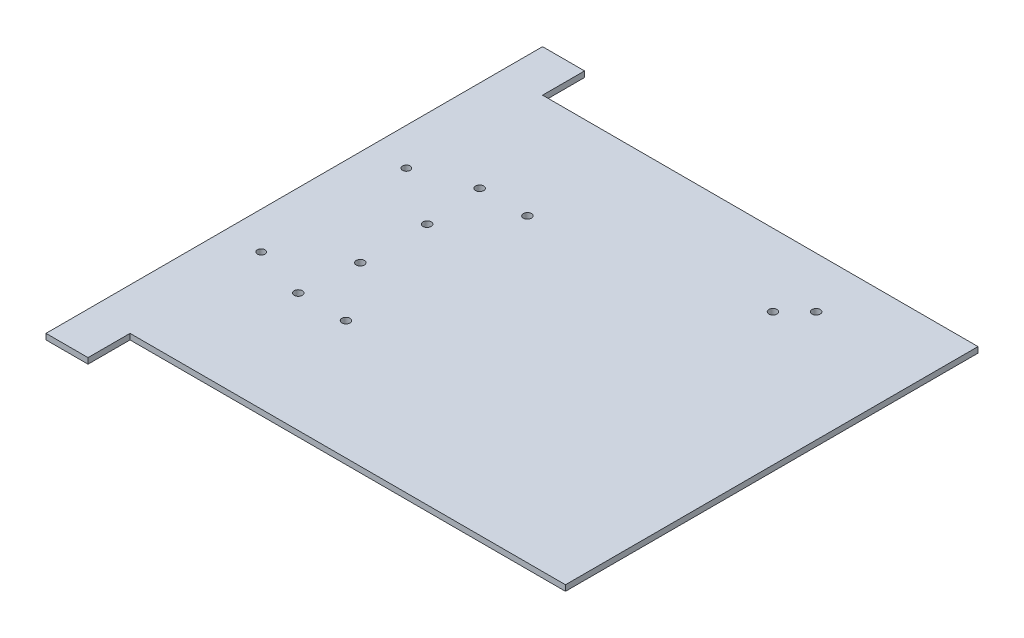
ISO-10303-21;
HEADER;
FILE_DESCRIPTION(('STEP AP214'),'2;1');
FILE_NAME('part.step','',(''),(''),'','','');
FILE_SCHEMA(('AUTOMOTIVE_DESIGN { 1 0 10303 214 1 1 1 1 }'));
ENDSEC;
DATA;
#1=APPLICATION_CONTEXT('core data for automotive mechanical design processes');
#2=APPLICATION_PROTOCOL_DEFINITION('international standard','automotive_design',2000,#1);
#3=PRODUCT_CONTEXT('',#1,'mechanical');
#4=PRODUCT('Part','Part','',(#3));
#5=PRODUCT_RELATED_PRODUCT_CATEGORY('part','',(#4));
#6=PRODUCT_DEFINITION_FORMATION('','',#4);
#7=PRODUCT_DEFINITION_CONTEXT('part definition',#1,'design');
#8=PRODUCT_DEFINITION('design','',#6,#7);
#9=PRODUCT_DEFINITION_SHAPE('','',#8);
#10=(LENGTH_UNIT() NAMED_UNIT(*) SI_UNIT(.MILLI.,.METRE.));
#11=(NAMED_UNIT(*) PLANE_ANGLE_UNIT() SI_UNIT($,.RADIAN.));
#12=(NAMED_UNIT(*) SI_UNIT($,.STERADIAN.) SOLID_ANGLE_UNIT());
#13=UNCERTAINTY_MEASURE_WITH_UNIT(LENGTH_MEASURE(1.E-05),#10,'distance_accuracy_value','');
#14=(GEOMETRIC_REPRESENTATION_CONTEXT(3) GLOBAL_UNCERTAINTY_ASSIGNED_CONTEXT((#13)) GLOBAL_UNIT_ASSIGNED_CONTEXT((#10,
#11,#12)) REPRESENTATION_CONTEXT('',''));
#15=CARTESIAN_POINT('',(0.,0.,0.));
#16=DIRECTION('',(0.,0.,1.));
#17=DIRECTION('',(1.,0.,0.));
#18=AXIS2_PLACEMENT_3D('',#15,#16,#17);
#19=CARTESIAN_POINT('',(-338.,3.,-108.));
#20=DIRECTION('',(0.,0.,1.));
#21=DIRECTION('',(1.,0.,0.));
#22=AXIS2_PLACEMENT_3D('',#19,#20,#21);
#23=PLANE('',#22);
#24=DIRECTION('',(-1.,0.,0.));
#25=VECTOR('',#24,1.);
#26=CARTESIAN_POINT('',(-338.,3.,-108.));
#27=LINE('',#26,#25);
#28=CARTESIAN_POINT('',(-110.,3.,-108.));
#29=VERTEX_POINT('',#28);
#30=CARTESIAN_POINT('',(-338.,3.,-108.));
#31=VERTEX_POINT('',#30);
#32=EDGE_CURVE('E97',#29,#31,#27,.T.);
#33=ORIENTED_EDGE('',*,*,#32,.F.);
#34=DIRECTION('',(0.,-1.,0.));
#35=VECTOR('',#34,1.);
#36=CARTESIAN_POINT('',(-110.,3.,-108.));
#37=LINE('',#36,#35);
#38=CARTESIAN_POINT('',(-110.,0.,-108.));
#39=VERTEX_POINT('',#38);
#40=EDGE_CURVE('E176',#29,#39,#37,.T.);
#41=ORIENTED_EDGE('',*,*,#40,.T.);
#42=DIRECTION('',(-1.,0.,0.));
#43=VECTOR('',#42,1.);
#44=CARTESIAN_POINT('',(-338.,0.,-108.));
#45=LINE('',#44,#43);
#46=CARTESIAN_POINT('',(-338.,0.,-108.));
#47=VERTEX_POINT('',#46);
#48=EDGE_CURVE('E138',#39,#47,#45,.T.);
#49=ORIENTED_EDGE('',*,*,#48,.T.);
#50=DIRECTION('',(0.,-1.,0.));
#51=VECTOR('',#50,1.);
#52=CARTESIAN_POINT('',(-338.,3.,-108.));
#53=LINE('',#52,#51);
#54=EDGE_CURVE('E11',#31,#47,#53,.T.);
#55=ORIENTED_EDGE('',*,*,#54,.F.);
#56=EDGE_LOOP('',(#33,#41,#49,#55));
#57=FACE_BOUND('',#56,.T.);
#58=ADVANCED_FACE('F39',(#57),#23,.F.);
#59=CARTESIAN_POINT('',(-338.,3.,-130.));
#60=DIRECTION('',(-1.,0.,0.));
#61=DIRECTION('',(0.,0.,1.));
#62=AXIS2_PLACEMENT_3D('',#59,#60,#61);
#63=PLANE('',#62);
#64=DIRECTION('',(0.,0.,-1.));
#65=VECTOR('',#64,1.);
#66=CARTESIAN_POINT('',(-338.,0.,-130.));
#67=LINE('',#66,#65);
#68=CARTESIAN_POINT('',(-338.,0.,-130.));
#69=VERTEX_POINT('',#68);
#70=EDGE_CURVE('E140',#47,#69,#67,.T.);
#71=ORIENTED_EDGE('',*,*,#70,.T.);
#72=DIRECTION('',(0.,-1.,0.));
#73=VECTOR('',#72,1.);
#74=CARTESIAN_POINT('',(-338.,3.,-130.));
#75=LINE('',#74,#73);
#76=CARTESIAN_POINT('',(-338.,3.,-130.));
#77=VERTEX_POINT('',#76);
#78=EDGE_CURVE('E46',#77,#69,#75,.T.);
#79=ORIENTED_EDGE('',*,*,#78,.F.);
#80=DIRECTION('',(0.,0.,-1.));
#81=VECTOR('',#80,1.);
#82=CARTESIAN_POINT('',(-338.,3.,-130.));
#83=LINE('',#82,#81);
#84=EDGE_CURVE('E244',#31,#77,#83,.T.);
#85=ORIENTED_EDGE('',*,*,#84,.F.);
#86=ORIENTED_EDGE('',*,*,#54,.T.);
#87=EDGE_LOOP('',(#71,#79,#85,#86));
#88=FACE_BOUND('',#87,.T.);
#89=ADVANCED_FACE('F245',(#88),#63,.F.);
#90=CARTESIAN_POINT('',(-360.,3.,-130.));
#91=DIRECTION('',(0.,0.,1.));
#92=DIRECTION('',(1.,0.,0.));
#93=AXIS2_PLACEMENT_3D('',#90,#91,#92);
#94=PLANE('',#93);
#95=DIRECTION('',(-1.,0.,0.));
#96=VECTOR('',#95,1.);
#97=CARTESIAN_POINT('',(-360.,0.,-130.));
#98=LINE('',#97,#96);
#99=CARTESIAN_POINT('',(-360.,0.,-130.));
#100=VERTEX_POINT('',#99);
#101=EDGE_CURVE('E143',#69,#100,#98,.T.);
#102=ORIENTED_EDGE('',*,*,#101,.T.);
#103=DIRECTION('',(0.,-1.,0.));
#104=VECTOR('',#103,1.);
#105=CARTESIAN_POINT('',(-360.,3.,-130.));
#106=LINE('',#105,#104);
#107=CARTESIAN_POINT('',(-360.,3.,-130.));
#108=VERTEX_POINT('',#107);
#109=EDGE_CURVE('E127',#108,#100,#106,.T.);
#110=ORIENTED_EDGE('',*,*,#109,.F.);
#111=DIRECTION('',(-1.,0.,0.));
#112=VECTOR('',#111,1.);
#113=CARTESIAN_POINT('',(-360.,3.,-130.));
#114=LINE('',#113,#112);
#115=EDGE_CURVE('E115',#77,#108,#114,.T.);
#116=ORIENTED_EDGE('',*,*,#115,.F.);
#117=ORIENTED_EDGE('',*,*,#78,.T.);
#118=EDGE_LOOP('',(#102,#110,#116,#117));
#119=FACE_BOUND('',#118,.T.);
#120=ADVANCED_FACE('F158',(#119),#94,.F.);
#121=CARTESIAN_POINT('',(-360.,3.,130.));
#122=DIRECTION('',(1.,0.,0.));
#123=DIRECTION('',(0.,0.,-1.));
#124=AXIS2_PLACEMENT_3D('',#121,#122,#123);
#125=PLANE('',#124);
#126=DIRECTION('',(0.,0.,1.));
#127=VECTOR('',#126,1.);
#128=CARTESIAN_POINT('',(-360.,0.,130.));
#129=LINE('',#128,#127);
#130=CARTESIAN_POINT('',(-360.,0.,130.));
#131=VERTEX_POINT('',#130);
#132=EDGE_CURVE('E124',#100,#131,#129,.T.);
#133=ORIENTED_EDGE('',*,*,#132,.T.);
#134=DIRECTION('',(0.,-1.,0.));
#135=VECTOR('',#134,1.);
#136=CARTESIAN_POINT('',(-360.,3.,130.));
#137=LINE('',#136,#135);
#138=CARTESIAN_POINT('',(-360.,3.,130.));
#139=VERTEX_POINT('',#138);
#140=EDGE_CURVE('E121',#139,#131,#137,.T.);
#141=ORIENTED_EDGE('',*,*,#140,.F.);
#142=DIRECTION('',(0.,0.,1.));
#143=VECTOR('',#142,1.);
#144=CARTESIAN_POINT('',(-360.,3.,130.));
#145=LINE('',#144,#143);
#146=EDGE_CURVE('E107',#108,#139,#145,.T.);
#147=ORIENTED_EDGE('',*,*,#146,.F.);
#148=ORIENTED_EDGE('',*,*,#109,.T.);
#149=EDGE_LOOP('',(#133,#141,#147,#148));
#150=FACE_BOUND('',#149,.T.);
#151=ADVANCED_FACE('F122',(#150),#125,.F.);
#152=CARTESIAN_POINT('',(-360.,3.,130.));
#153=DIRECTION('',(0.,0.,-1.));
#154=DIRECTION('',(-1.,0.,0.));
#155=AXIS2_PLACEMENT_3D('',#152,#153,#154);
#156=PLANE('',#155);
#157=DIRECTION('',(1.,0.,0.));
#158=VECTOR('',#157,1.);
#159=CARTESIAN_POINT('',(-360.,0.,130.));
#160=LINE('',#159,#158);
#161=CARTESIAN_POINT('',(-338.,0.,130.));
#162=VERTEX_POINT('',#161);
#163=EDGE_CURVE('E146',#131,#162,#160,.T.);
#164=ORIENTED_EDGE('',*,*,#163,.T.);
#165=DIRECTION('',(0.,-1.,0.));
#166=VECTOR('',#165,1.);
#167=CARTESIAN_POINT('',(-338.,3.,130.));
#168=LINE('',#167,#166);
#169=CARTESIAN_POINT('',(-338.,3.,130.));
#170=VERTEX_POINT('',#169);
#171=EDGE_CURVE('E128',#170,#162,#168,.T.);
#172=ORIENTED_EDGE('',*,*,#171,.F.);
#173=DIRECTION('',(1.,0.,0.));
#174=VECTOR('',#173,1.);
#175=CARTESIAN_POINT('',(-360.,3.,130.));
#176=LINE('',#175,#174);
#177=EDGE_CURVE('E112',#139,#170,#176,.T.);
#178=ORIENTED_EDGE('',*,*,#177,.F.);
#179=ORIENTED_EDGE('',*,*,#140,.T.);
#180=EDGE_LOOP('',(#164,#172,#178,#179));
#181=FACE_BOUND('',#180,.T.);
#182=ADVANCED_FACE('F130',(#181),#156,.F.);
#183=CARTESIAN_POINT('',(-338.,3.,130.));
#184=DIRECTION('',(-1.,0.,0.));
#185=DIRECTION('',(0.,0.,1.));
#186=AXIS2_PLACEMENT_3D('',#183,#184,#185);
#187=PLANE('',#186);
#188=DIRECTION('',(0.,0.,-1.));
#189=VECTOR('',#188,1.);
#190=CARTESIAN_POINT('',(-338.,0.,130.));
#191=LINE('',#190,#189);
#192=CARTESIAN_POINT('',(-338.,0.,108.));
#193=VERTEX_POINT('',#192);
#194=EDGE_CURVE('E89',#162,#193,#191,.T.);
#195=ORIENTED_EDGE('',*,*,#194,.T.);
#196=DIRECTION('',(0.,-1.,0.));
#197=VECTOR('',#196,1.);
#198=CARTESIAN_POINT('',(-338.,3.,108.));
#199=LINE('',#198,#197);
#200=CARTESIAN_POINT('',(-338.,3.,108.));
#201=VERTEX_POINT('',#200);
#202=EDGE_CURVE('E137',#201,#193,#199,.T.);
#203=ORIENTED_EDGE('',*,*,#202,.F.);
#204=DIRECTION('',(0.,0.,-1.));
#205=VECTOR('',#204,1.);
#206=CARTESIAN_POINT('',(-338.,3.,130.));
#207=LINE('',#206,#205);
#208=EDGE_CURVE('E62',#170,#201,#207,.T.);
#209=ORIENTED_EDGE('',*,*,#208,.F.);
#210=ORIENTED_EDGE('',*,*,#171,.T.);
#211=EDGE_LOOP('',(#195,#203,#209,#210));
#212=FACE_BOUND('',#211,.T.);
#213=ADVANCED_FACE('F166',(#212),#187,.F.);
#214=CARTESIAN_POINT('',(-338.,3.,108.));
#215=DIRECTION('',(0.,0.,-1.));
#216=DIRECTION('',(-1.,0.,0.));
#217=AXIS2_PLACEMENT_3D('',#214,#215,#216);
#218=PLANE('',#217);
#219=DIRECTION('',(1.,0.,0.));
#220=VECTOR('',#219,1.);
#221=CARTESIAN_POINT('',(-338.,0.,108.));
#222=LINE('',#221,#220);
#223=CARTESIAN_POINT('',(-110.,0.,108.));
#224=VERTEX_POINT('',#223);
#225=EDGE_CURVE('E149',#193,#224,#222,.T.);
#226=ORIENTED_EDGE('',*,*,#225,.T.);
#227=DIRECTION('',(0.,1.,0.));
#228=VECTOR('',#227,1.);
#229=CARTESIAN_POINT('',(-110.,3.,108.));
#230=LINE('',#229,#228);
#231=CARTESIAN_POINT('',(-110.,3.,108.));
#232=VERTEX_POINT('',#231);
#233=EDGE_CURVE('E53',#224,#232,#230,.T.);
#234=ORIENTED_EDGE('',*,*,#233,.T.);
#235=DIRECTION('',(1.,0.,0.));
#236=VECTOR('',#235,1.);
#237=CARTESIAN_POINT('',(-338.,3.,108.));
#238=LINE('',#237,#236);
#239=EDGE_CURVE('E132',#201,#232,#238,.T.);
#240=ORIENTED_EDGE('',*,*,#239,.F.);
#241=ORIENTED_EDGE('',*,*,#202,.T.);
#242=EDGE_LOOP('',(#226,#234,#240,#241));
#243=FACE_BOUND('',#242,.T.);
#244=ADVANCED_FACE('F169',(#243),#218,.F.);
#245=CARTESIAN_POINT('',(0.,3.,0.));
#246=DIRECTION('',(0.,1.,0.));
#247=DIRECTION('',(0.,0.,1.));
#248=AXIS2_PLACEMENT_3D('',#245,#246,#247);
#249=PLANE('',#248);
#250=DIRECTION('',(0.,0.,1.));
#251=VECTOR('',#250,1.);
#252=CARTESIAN_POINT('',(-110.,3.,130.));
#253=LINE('',#252,#251);
#254=EDGE_CURVE('E172',#29,#232,#253,.T.);
#255=ORIENTED_EDGE('',*,*,#254,.F.);
#256=ORIENTED_EDGE('',*,*,#32,.T.);
#257=ORIENTED_EDGE('',*,*,#84,.T.);
#258=ORIENTED_EDGE('',*,*,#115,.T.);
#259=ORIENTED_EDGE('',*,*,#146,.T.);
#260=ORIENTED_EDGE('',*,*,#177,.T.);
#261=ORIENTED_EDGE('',*,*,#208,.T.);
#262=ORIENTED_EDGE('',*,*,#239,.T.);
#263=EDGE_LOOP('',(#255,#256,#257,#258,#259,#260,#261,#262));
#264=FACE_BOUND('',#263,.T.);
#265=CARTESIAN_POINT('',(-179.463524521425,3.,-70.0896093801179));
#266=DIRECTION('',(0.,1.,0.));
#267=DIRECTION('',(0.,0.,1.));
#268=AXIS2_PLACEMENT_3D('',#265,#266,#267);
#269=CIRCLE('',#268,2.1249999999999);
#270=CARTESIAN_POINT('',(-179.463524521425,3.,-67.964609380118));
#271=VERTEX_POINT('',#270);
#272=EDGE_CURVE('E191',#271,#271,#269,.T.);
#273=ORIENTED_EDGE('',*,*,#272,.F.);
#274=EDGE_LOOP('',(#273));
#275=FACE_BOUND('',#274,.T.);
#276=CARTESIAN_POINT('',(-168.14981602244,3.,-81.4033178791027));
#277=DIRECTION('',(0.,1.,0.));
#278=DIRECTION('',(0.,0.,-1.));
#279=AXIS2_PLACEMENT_3D('',#276,#277,#278);
#280=CIRCLE('',#279,2.12499999999992);
#281=CARTESIAN_POINT('',(-168.14981602244,3.,-83.5283178791026));
#282=VERTEX_POINT('',#281);
#283=EDGE_CURVE('E183',#282,#282,#280,.T.);
#284=ORIENTED_EDGE('',*,*,#283,.F.);
#285=EDGE_LOOP('',(#284));
#286=FACE_BOUND('',#285,.T.);
#287=CARTESIAN_POINT('',(-340.559035691141,3.,-39.2438312840594));
#288=DIRECTION('',(0.,1.,0.));
#289=DIRECTION('',(0.,0.,-1.));
#290=AXIS2_PLACEMENT_3D('',#287,#288,#289);
#291=CIRCLE('',#290,2.);
#292=CARTESIAN_POINT('',(-340.559035691141,3.,-41.2438312840594));
#293=VERTEX_POINT('',#292);
#294=EDGE_CURVE('E204',#293,#293,#291,.T.);
#295=ORIENTED_EDGE('',*,*,#294,.F.);
#296=EDGE_LOOP('',(#295));
#297=FACE_BOUND('',#296,.T.);
#298=CARTESIAN_POINT('',(-340.559035691141,3.,36.7561687159405));
#299=DIRECTION('',(0.,1.,0.));
#300=DIRECTION('',(0.,0.,1.));
#301=AXIS2_PLACEMENT_3D('',#298,#299,#300);
#302=CIRCLE('',#301,2.);
#303=CARTESIAN_POINT('',(-340.559035691141,3.,38.7561687159405));
#304=VERTEX_POINT('',#303);
#305=EDGE_CURVE('E197',#304,#304,#302,.T.);
#306=ORIENTED_EDGE('',*,*,#305,.F.);
#307=EDGE_LOOP('',(#306));
#308=FACE_BOUND('',#307,.T.);
#309=CARTESIAN_POINT('',(-309.736142764565,3.,15.6971330247991));
#310=DIRECTION('',(0.,1.,0.));
#311=DIRECTION('',(0.,0.,-1.));
#312=AXIS2_PLACEMENT_3D('',#309,#310,#311);
#313=CIRCLE('',#312,2.125);
#314=CARTESIAN_POINT('',(-309.736142764565,3.,13.5721330247991));
#315=VERTEX_POINT('',#314);
#316=EDGE_CURVE('E238',#315,#315,#313,.T.);
#317=ORIENTED_EDGE('',*,*,#316,.F.);
#318=EDGE_LOOP('',(#317));
#319=FACE_BOUND('',#318,.T.);
#320=CARTESIAN_POINT('',(-312.236142764565,3.,45.6971330247991));
#321=DIRECTION('',(0.,1.,0.));
#322=DIRECTION('',(0.,0.,-1.));
#323=AXIS2_PLACEMENT_3D('',#320,#321,#322);
#324=CIRCLE('',#323,2.125);
#325=CARTESIAN_POINT('',(-312.236142764565,3.,43.5721330247991));
#326=VERTEX_POINT('',#325);
#327=EDGE_CURVE('E232',#326,#326,#324,.T.);
#328=ORIENTED_EDGE('',*,*,#327,.F.);
#329=EDGE_LOOP('',(#328));
#330=FACE_BOUND('',#329,.T.);
#331=CARTESIAN_POINT('',(-287.236142764565,3.,45.6971330247991));
#332=DIRECTION('',(0.,1.,0.));
#333=DIRECTION('',(0.,0.,-1.));
#334=AXIS2_PLACEMENT_3D('',#331,#332,#333);
#335=CIRCLE('',#334,2.125);
#336=CARTESIAN_POINT('',(-287.236142764565,3.,43.5721330247991));
#337=VERTEX_POINT('',#336);
#338=EDGE_CURVE('E141',#337,#337,#335,.T.);
#339=ORIENTED_EDGE('',*,*,#338,.F.);
#340=EDGE_LOOP('',(#339));
#341=FACE_BOUND('',#340,.T.);
#342=CARTESIAN_POINT('',(-312.236142764565,3.,-49.3028669752009));
#343=DIRECTION('',(0.,1.,0.));
#344=DIRECTION('',(0.,0.,-1.));
#345=AXIS2_PLACEMENT_3D('',#342,#343,#344);
#346=CIRCLE('',#345,2.125);
#347=CARTESIAN_POINT('',(-312.236142764565,3.,-51.4278669752009));
#348=VERTEX_POINT('',#347);
#349=EDGE_CURVE('E209',#348,#348,#346,.T.);
#350=ORIENTED_EDGE('',*,*,#349,.F.);
#351=EDGE_LOOP('',(#350));
#352=FACE_BOUND('',#351,.T.);
#353=CARTESIAN_POINT('',(-287.236142764565,3.,-49.3028669752009));
#354=DIRECTION('',(0.,1.,0.));
#355=DIRECTION('',(0.,0.,-1.));
#356=AXIS2_PLACEMENT_3D('',#353,#354,#355);
#357=CIRCLE('',#356,2.125);
#358=CARTESIAN_POINT('',(-287.236142764565,3.,-51.4278669752009));
#359=VERTEX_POINT('',#358);
#360=EDGE_CURVE('E222',#359,#359,#357,.T.);
#361=ORIENTED_EDGE('',*,*,#360,.F.);
#362=EDGE_LOOP('',(#361));
#363=FACE_BOUND('',#362,.T.);
#364=CARTESIAN_POINT('',(-309.736142764565,3.,-19.3028669752009));
#365=DIRECTION('',(0.,1.,0.));
#366=DIRECTION('',(0.,0.,-1.));
#367=AXIS2_PLACEMENT_3D('',#364,#365,#366);
#368=CIRCLE('',#367,2.125);
#369=CARTESIAN_POINT('',(-309.736142764565,3.,-21.4278669752009));
#370=VERTEX_POINT('',#369);
#371=EDGE_CURVE('E215',#370,#370,#368,.T.);
#372=ORIENTED_EDGE('',*,*,#371,.F.);
#373=EDGE_LOOP('',(#372));
#374=FACE_BOUND('',#373,.T.);
#375=ADVANCED_FACE('F109',(#264,#275,#286,#297,#308,#319,#330,#341,#352,#363,#374),#249,.T.);
#376=CARTESIAN_POINT('',(0.,0.,0.));
#377=DIRECTION('',(0.,1.,0.));
#378=DIRECTION('',(0.,0.,1.));
#379=AXIS2_PLACEMENT_3D('',#376,#377,#378);
#380=PLANE('',#379);
#381=CARTESIAN_POINT('',(-179.463524521425,0.,-70.0896093801179));
#382=DIRECTION('',(0.,1.,0.));
#383=DIRECTION('',(0.,0.,1.));
#384=AXIS2_PLACEMENT_3D('',#381,#382,#383);
#385=CIRCLE('',#384,2.1249999999999);
#386=CARTESIAN_POINT('',(-179.463524521425,0.,-67.964609380118));
#387=VERTEX_POINT('',#386);
#388=EDGE_CURVE('E189',#387,#387,#385,.T.);
#389=ORIENTED_EDGE('',*,*,#388,.T.);
#390=EDGE_LOOP('',(#389));
#391=FACE_BOUND('',#390,.T.);
#392=CARTESIAN_POINT('',(-168.14981602244,0.,-81.4033178791027));
#393=DIRECTION('',(0.,1.,0.));
#394=DIRECTION('',(0.,0.,-1.));
#395=AXIS2_PLACEMENT_3D('',#392,#393,#394);
#396=CIRCLE('',#395,2.12499999999992);
#397=CARTESIAN_POINT('',(-168.14981602244,0.,-83.5283178791026));
#398=VERTEX_POINT('',#397);
#399=EDGE_CURVE('E180',#398,#398,#396,.T.);
#400=ORIENTED_EDGE('',*,*,#399,.T.);
#401=EDGE_LOOP('',(#400));
#402=FACE_BOUND('',#401,.T.);
#403=CARTESIAN_POINT('',(-340.559035691141,0.,-39.2438312840594));
#404=DIRECTION('',(0.,1.,0.));
#405=DIRECTION('',(0.,0.,-1.));
#406=AXIS2_PLACEMENT_3D('',#403,#404,#405);
#407=CIRCLE('',#406,2.);
#408=CARTESIAN_POINT('',(-340.559035691141,0.,-41.2438312840594));
#409=VERTEX_POINT('',#408);
#410=EDGE_CURVE('E194',#409,#409,#407,.T.);
#411=ORIENTED_EDGE('',*,*,#410,.T.);
#412=EDGE_LOOP('',(#411));
#413=FACE_BOUND('',#412,.T.);
#414=CARTESIAN_POINT('',(-340.559035691141,0.,36.7561687159405));
#415=DIRECTION('',(0.,1.,0.));
#416=DIRECTION('',(0.,0.,1.));
#417=AXIS2_PLACEMENT_3D('',#414,#415,#416);
#418=CIRCLE('',#417,2.);
#419=CARTESIAN_POINT('',(-340.559035691141,0.,38.7561687159405));
#420=VERTEX_POINT('',#419);
#421=EDGE_CURVE('E201',#420,#420,#418,.T.);
#422=ORIENTED_EDGE('',*,*,#421,.T.);
#423=EDGE_LOOP('',(#422));
#424=FACE_BOUND('',#423,.T.);
#425=CARTESIAN_POINT('',(-309.736142764565,0.,15.6971330247991));
#426=DIRECTION('',(0.,1.,0.));
#427=DIRECTION('',(0.,0.,-1.));
#428=AXIS2_PLACEMENT_3D('',#425,#426,#427);
#429=CIRCLE('',#428,2.125);
#430=CARTESIAN_POINT('',(-309.736142764565,0.,13.5721330247991));
#431=VERTEX_POINT('',#430);
#432=EDGE_CURVE('E218',#431,#431,#429,.T.);
#433=ORIENTED_EDGE('',*,*,#432,.T.);
#434=EDGE_LOOP('',(#433));
#435=FACE_BOUND('',#434,.T.);
#436=CARTESIAN_POINT('',(-312.236142764565,0.,45.6971330247991));
#437=DIRECTION('',(0.,1.,0.));
#438=DIRECTION('',(0.,0.,-1.));
#439=AXIS2_PLACEMENT_3D('',#436,#437,#438);
#440=CIRCLE('',#439,2.125);
#441=CARTESIAN_POINT('',(-312.236142764565,0.,43.5721330247991));
#442=VERTEX_POINT('',#441);
#443=EDGE_CURVE('E235',#442,#442,#440,.T.);
#444=ORIENTED_EDGE('',*,*,#443,.T.);
#445=EDGE_LOOP('',(#444));
#446=FACE_BOUND('',#445,.T.);
#447=CARTESIAN_POINT('',(-287.236142764565,0.,45.6971330247991));
#448=DIRECTION('',(0.,1.,0.));
#449=DIRECTION('',(0.,0.,-1.));
#450=AXIS2_PLACEMENT_3D('',#447,#448,#449);
#451=CIRCLE('',#450,2.125);
#452=CARTESIAN_POINT('',(-287.236142764565,0.,43.5721330247991));
#453=VERTEX_POINT('',#452);
#454=EDGE_CURVE('E229',#453,#453,#451,.T.);
#455=ORIENTED_EDGE('',*,*,#454,.T.);
#456=EDGE_LOOP('',(#455));
#457=FACE_BOUND('',#456,.T.);
#458=CARTESIAN_POINT('',(-312.236142764565,0.,-49.3028669752009));
#459=DIRECTION('',(0.,1.,0.));
#460=DIRECTION('',(0.,0.,-1.));
#461=AXIS2_PLACEMENT_3D('',#458,#459,#460);
#462=CIRCLE('',#461,2.125);
#463=CARTESIAN_POINT('',(-312.236142764565,0.,-51.4278669752009));
#464=VERTEX_POINT('',#463);
#465=EDGE_CURVE('E200',#464,#464,#462,.T.);
#466=ORIENTED_EDGE('',*,*,#465,.T.);
#467=EDGE_LOOP('',(#466));
#468=FACE_BOUND('',#467,.T.);
#469=CARTESIAN_POINT('',(-287.236142764565,0.,-49.3028669752009));
#470=DIRECTION('',(0.,1.,0.));
#471=DIRECTION('',(0.,0.,-1.));
#472=AXIS2_PLACEMENT_3D('',#469,#470,#471);
#473=CIRCLE('',#472,2.125);
#474=CARTESIAN_POINT('',(-287.236142764565,0.,-51.4278669752009));
#475=VERTEX_POINT('',#474);
#476=EDGE_CURVE('E212',#475,#475,#473,.T.);
#477=ORIENTED_EDGE('',*,*,#476,.T.);
#478=EDGE_LOOP('',(#477));
#479=FACE_BOUND('',#478,.T.);
#480=CARTESIAN_POINT('',(-309.736142764565,0.,-19.3028669752009));
#481=DIRECTION('',(0.,1.,0.));
#482=DIRECTION('',(0.,0.,-1.));
#483=AXIS2_PLACEMENT_3D('',#480,#481,#482);
#484=CIRCLE('',#483,2.125);
#485=CARTESIAN_POINT('',(-309.736142764565,0.,-21.4278669752009));
#486=VERTEX_POINT('',#485);
#487=EDGE_CURVE('E219',#486,#486,#484,.T.);
#488=ORIENTED_EDGE('',*,*,#487,.T.);
#489=EDGE_LOOP('',(#488));
#490=FACE_BOUND('',#489,.T.);
#491=ORIENTED_EDGE('',*,*,#48,.F.);
#492=DIRECTION('',(0.,0.,1.));
#493=VECTOR('',#492,1.);
#494=CARTESIAN_POINT('',(-110.,0.,130.));
#495=LINE('',#494,#493);
#496=EDGE_CURVE('E178',#39,#224,#495,.T.);
#497=ORIENTED_EDGE('',*,*,#496,.T.);
#498=ORIENTED_EDGE('',*,*,#225,.F.);
#499=ORIENTED_EDGE('',*,*,#194,.F.);
#500=ORIENTED_EDGE('',*,*,#163,.F.);
#501=ORIENTED_EDGE('',*,*,#132,.F.);
#502=ORIENTED_EDGE('',*,*,#101,.F.);
#503=ORIENTED_EDGE('',*,*,#70,.F.);
#504=EDGE_LOOP('',(#491,#497,#498,#499,#500,#501,#502,#503));
#505=FACE_BOUND('',#504,.T.);
#506=ADVANCED_FACE('F164',(#391,#402,#413,#424,#435,#446,#457,#468,#479,#490,#505),#380,.F.);
#507=CARTESIAN_POINT('',(-309.736142764565,0.,-19.3028669752009));
#508=DIRECTION('',(0.,1.,0.));
#509=DIRECTION('',(0.,0.,1.));
#510=AXIS2_PLACEMENT_3D('',#507,#508,#509);
#511=CYLINDRICAL_SURFACE('',#510,2.125);
#512=ORIENTED_EDGE('',*,*,#487,.F.);
#513=EDGE_LOOP('',(#512));
#514=FACE_BOUND('',#513,.T.);
#515=ORIENTED_EDGE('',*,*,#371,.T.);
#516=EDGE_LOOP('',(#515));
#517=FACE_BOUND('',#516,.T.);
#518=ADVANCED_FACE('F267',(#514,#517),#511,.F.);
#519=CARTESIAN_POINT('',(-287.236142764565,0.,-49.3028669752009));
#520=DIRECTION('',(0.,1.,0.));
#521=DIRECTION('',(0.,0.,1.));
#522=AXIS2_PLACEMENT_3D('',#519,#520,#521);
#523=CYLINDRICAL_SURFACE('',#522,2.125);
#524=ORIENTED_EDGE('',*,*,#476,.F.);
#525=EDGE_LOOP('',(#524));
#526=FACE_BOUND('',#525,.T.);
#527=ORIENTED_EDGE('',*,*,#360,.T.);
#528=EDGE_LOOP('',(#527));
#529=FACE_BOUND('',#528,.T.);
#530=ADVANCED_FACE('F285',(#526,#529),#523,.F.);
#531=CARTESIAN_POINT('',(-312.236142764565,0.,-49.3028669752009));
#532=DIRECTION('',(0.,1.,0.));
#533=DIRECTION('',(0.,0.,1.));
#534=AXIS2_PLACEMENT_3D('',#531,#532,#533);
#535=CYLINDRICAL_SURFACE('',#534,2.125);
#536=ORIENTED_EDGE('',*,*,#465,.F.);
#537=EDGE_LOOP('',(#536));
#538=FACE_BOUND('',#537,.T.);
#539=ORIENTED_EDGE('',*,*,#349,.T.);
#540=EDGE_LOOP('',(#539));
#541=FACE_BOUND('',#540,.T.);
#542=ADVANCED_FACE('F283',(#538,#541),#535,.F.);
#543=CARTESIAN_POINT('',(-287.236142764565,0.,45.6971330247991));
#544=DIRECTION('',(0.,1.,0.));
#545=DIRECTION('',(0.,0.,1.));
#546=AXIS2_PLACEMENT_3D('',#543,#544,#545);
#547=CYLINDRICAL_SURFACE('',#546,2.125);
#548=ORIENTED_EDGE('',*,*,#454,.F.);
#549=EDGE_LOOP('',(#548));
#550=FACE_BOUND('',#549,.T.);
#551=ORIENTED_EDGE('',*,*,#338,.T.);
#552=EDGE_LOOP('',(#551));
#553=FACE_BOUND('',#552,.T.);
#554=ADVANCED_FACE('F279',(#550,#553),#547,.F.);
#555=CARTESIAN_POINT('',(-312.236142764565,0.,45.6971330247991));
#556=DIRECTION('',(0.,1.,0.));
#557=DIRECTION('',(0.,0.,1.));
#558=AXIS2_PLACEMENT_3D('',#555,#556,#557);
#559=CYLINDRICAL_SURFACE('',#558,2.125);
#560=ORIENTED_EDGE('',*,*,#443,.F.);
#561=EDGE_LOOP('',(#560));
#562=FACE_BOUND('',#561,.T.);
#563=ORIENTED_EDGE('',*,*,#327,.T.);
#564=EDGE_LOOP('',(#563));
#565=FACE_BOUND('',#564,.T.);
#566=ADVANCED_FACE('F275',(#562,#565),#559,.F.);
#567=CARTESIAN_POINT('',(-309.736142764565,0.,15.6971330247991));
#568=DIRECTION('',(0.,1.,0.));
#569=DIRECTION('',(0.,0.,1.));
#570=AXIS2_PLACEMENT_3D('',#567,#568,#569);
#571=CYLINDRICAL_SURFACE('',#570,2.125);
#572=ORIENTED_EDGE('',*,*,#432,.F.);
#573=EDGE_LOOP('',(#572));
#574=FACE_BOUND('',#573,.T.);
#575=ORIENTED_EDGE('',*,*,#316,.T.);
#576=EDGE_LOOP('',(#575));
#577=FACE_BOUND('',#576,.T.);
#578=ADVANCED_FACE('F271',(#574,#577),#571,.F.);
#579=CARTESIAN_POINT('',(-340.559035691141,0.,36.7561687159405));
#580=DIRECTION('',(0.,1.,0.));
#581=DIRECTION('',(0.,0.,1.));
#582=AXIS2_PLACEMENT_3D('',#579,#580,#581);
#583=CYLINDRICAL_SURFACE('',#582,2.);
#584=ORIENTED_EDGE('',*,*,#421,.F.);
#585=EDGE_LOOP('',(#584));
#586=FACE_BOUND('',#585,.T.);
#587=ORIENTED_EDGE('',*,*,#305,.T.);
#588=EDGE_LOOP('',(#587));
#589=FACE_BOUND('',#588,.T.);
#590=ADVANCED_FACE('F274',(#586,#589),#583,.F.);
#591=CARTESIAN_POINT('',(-340.559035691141,0.,-39.2438312840594));
#592=DIRECTION('',(0.,1.,0.));
#593=DIRECTION('',(0.,0.,1.));
#594=AXIS2_PLACEMENT_3D('',#591,#592,#593);
#595=CYLINDRICAL_SURFACE('',#594,2.);
#596=ORIENTED_EDGE('',*,*,#410,.F.);
#597=EDGE_LOOP('',(#596));
#598=FACE_BOUND('',#597,.T.);
#599=ORIENTED_EDGE('',*,*,#294,.T.);
#600=EDGE_LOOP('',(#599));
#601=FACE_BOUND('',#600,.T.);
#602=ADVANCED_FACE('F295',(#598,#601),#595,.F.);
#603=CARTESIAN_POINT('',(-168.14981602244,0.,-81.4033178791027));
#604=DIRECTION('',(0.,1.,0.));
#605=DIRECTION('',(0.,0.,1.));
#606=AXIS2_PLACEMENT_3D('',#603,#604,#605);
#607=CYLINDRICAL_SURFACE('',#606,2.12499999999992);
#608=ORIENTED_EDGE('',*,*,#399,.F.);
#609=EDGE_LOOP('',(#608));
#610=FACE_BOUND('',#609,.T.);
#611=ORIENTED_EDGE('',*,*,#283,.T.);
#612=EDGE_LOOP('',(#611));
#613=FACE_BOUND('',#612,.T.);
#614=ADVANCED_FACE('F298',(#610,#613),#607,.F.);
#615=CARTESIAN_POINT('',(-179.463524521425,0.,-70.0896093801179));
#616=DIRECTION('',(0.,1.,0.));
#617=DIRECTION('',(0.,0.,1.));
#618=AXIS2_PLACEMENT_3D('',#615,#616,#617);
#619=CYLINDRICAL_SURFACE('',#618,2.1249999999999);
#620=ORIENTED_EDGE('',*,*,#388,.F.);
#621=EDGE_LOOP('',(#620));
#622=FACE_BOUND('',#621,.T.);
#623=ORIENTED_EDGE('',*,*,#272,.T.);
#624=EDGE_LOOP('',(#623));
#625=FACE_BOUND('',#624,.T.);
#626=ADVANCED_FACE('F303',(#622,#625),#619,.F.);
#627=CARTESIAN_POINT('',(-110.,0.,130.));
#628=DIRECTION('',(-1.,0.,0.));
#629=DIRECTION('',(0.,0.,1.));
#630=AXIS2_PLACEMENT_3D('',#627,#628,#629);
#631=PLANE('',#630);
#632=ORIENTED_EDGE('',*,*,#254,.T.);
#633=ORIENTED_EDGE('',*,*,#233,.F.);
#634=ORIENTED_EDGE('',*,*,#496,.F.);
#635=ORIENTED_EDGE('',*,*,#40,.F.);
#636=EDGE_LOOP('',(#632,#633,#634,#635));
#637=FACE_BOUND('',#636,.T.);
#638=ADVANCED_FACE('F177',(#637),#631,.F.);
#639=CLOSED_SHELL('',(#58,#89,#120,#151,#182,#213,#244,#375,#506,#518,#530,#542,#554,#566,#578,
#590,#602,#614,#626,#638));
#640=MANIFOLD_SOLID_BREP('B2',#639);
#641=ADVANCED_BREP_SHAPE_REPRESENTATION('',(#18,#640),#14);
#642=SHAPE_DEFINITION_REPRESENTATION(#9,#641);
ENDSEC;
END-ISO-10303-21;
